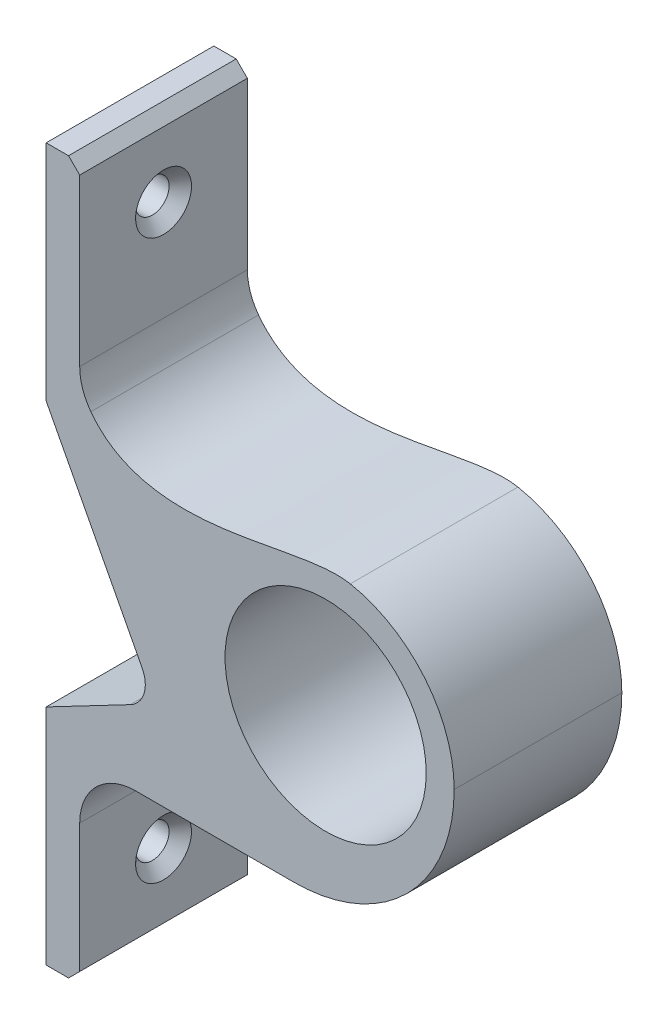
ISO-10303-21;
HEADER;
FILE_DESCRIPTION(('STEP AP214'),'2;1');
FILE_NAME('part.step','',(''),(''),'','','');
FILE_SCHEMA(('AUTOMOTIVE_DESIGN { 1 0 10303 214 1 1 1 1 }'));
ENDSEC;
DATA;
#1=APPLICATION_CONTEXT('core data for automotive mechanical design processes');
#2=APPLICATION_PROTOCOL_DEFINITION('international standard','automotive_design',2000,#1);
#3=PRODUCT_CONTEXT('',#1,'mechanical');
#4=PRODUCT('Part','Part','',(#3));
#5=PRODUCT_RELATED_PRODUCT_CATEGORY('part','',(#4));
#6=PRODUCT_DEFINITION_FORMATION('','',#4);
#7=PRODUCT_DEFINITION_CONTEXT('part definition',#1,'design');
#8=PRODUCT_DEFINITION('design','',#6,#7);
#9=PRODUCT_DEFINITION_SHAPE('','',#8);
#10=(LENGTH_UNIT() NAMED_UNIT(*) SI_UNIT(.MILLI.,.METRE.));
#11=(NAMED_UNIT(*) PLANE_ANGLE_UNIT() SI_UNIT($,.RADIAN.));
#12=(NAMED_UNIT(*) SI_UNIT($,.STERADIAN.) SOLID_ANGLE_UNIT());
#13=UNCERTAINTY_MEASURE_WITH_UNIT(LENGTH_MEASURE(1.E-05),#10,'distance_accuracy_value','');
#14=(GEOMETRIC_REPRESENTATION_CONTEXT(3) GLOBAL_UNCERTAINTY_ASSIGNED_CONTEXT((#13)) GLOBAL_UNIT_ASSIGNED_CONTEXT((#10,
#11,#12)) REPRESENTATION_CONTEXT('',''));
#15=CARTESIAN_POINT('',(0.,0.,0.));
#16=DIRECTION('',(0.,0.,1.));
#17=DIRECTION('',(1.,0.,0.));
#18=AXIS2_PLACEMENT_3D('',#15,#16,#17);
#19=CARTESIAN_POINT('',(44.2934608177406,0.,15.));
#20=DIRECTION('',(0.,0.,-1.));
#21=DIRECTION('',(-1.,0.,0.));
#22=AXIS2_PLACEMENT_3D('',#19,#20,#21);
#23=CYLINDRICAL_SURFACE('',#22,28.7065391822594);
#24=CARTESIAN_POINT('',(44.2934608177406,0.,-15.));
#25=DIRECTION('',(0.,0.,1.));
#26=DIRECTION('',(1.,0.,0.));
#27=AXIS2_PLACEMENT_3D('',#24,#25,#26);
#28=CIRCLE('',#27,28.7065391822594);
#29=CARTESIAN_POINT('',(44.2934608177406,-28.7065391822594,-15.));
#30=VERTEX_POINT('',#29);
#31=CARTESIAN_POINT('',(73.,0.,-15.));
#32=VERTEX_POINT('',#31);
#33=EDGE_CURVE('E197',#30,#32,#28,.T.);
#34=ORIENTED_EDGE('',*,*,#33,.T.);
#35=DIRECTION('',(0.,0.,-1.));
#36=VECTOR('',#35,1.);
#37=CARTESIAN_POINT('',(73.,0.,15.));
#38=LINE('',#37,#36);
#39=CARTESIAN_POINT('',(73.,0.,15.));
#40=VERTEX_POINT('',#39);
#41=EDGE_CURVE('E176',#40,#32,#38,.T.);
#42=ORIENTED_EDGE('',*,*,#41,.F.);
#43=CARTESIAN_POINT('',(44.2934608177406,0.,15.));
#44=DIRECTION('',(0.,0.,1.));
#45=DIRECTION('',(1.,0.,0.));
#46=AXIS2_PLACEMENT_3D('',#43,#44,#45);
#47=CIRCLE('',#46,28.7065391822594);
#48=CARTESIAN_POINT('',(44.2934608177406,-28.7065391822594,15.));
#49=VERTEX_POINT('',#48);
#50=EDGE_CURVE('E183',#49,#40,#47,.T.);
#51=ORIENTED_EDGE('',*,*,#50,.F.);
#52=DIRECTION('',(0.,0.,-1.));
#53=VECTOR('',#52,1.);
#54=CARTESIAN_POINT('',(44.2934608177406,-28.7065391822594,15.));
#55=LINE('',#54,#53);
#56=EDGE_CURVE('E316',#49,#30,#55,.T.);
#57=ORIENTED_EDGE('',*,*,#56,.T.);
#58=EDGE_LOOP('',(#34,#42,#51,#57));
#59=FACE_BOUND('',#58,.T.);
#60=ADVANCED_FACE('F49',(#59),#23,.T.);
#61=CARTESIAN_POINT('',(50.,0.,15.));
#62=DIRECTION('',(0.,0.,-1.));
#63=DIRECTION('',(-1.,0.,0.));
#64=AXIS2_PLACEMENT_3D('',#61,#62,#63);
#65=CYLINDRICAL_SURFACE('',#64,23.);
#66=CARTESIAN_POINT('',(50.,0.,-15.));
#67=DIRECTION('',(0.,0.,1.));
#68=DIRECTION('',(1.,0.,0.));
#69=AXIS2_PLACEMENT_3D('',#66,#67,#68);
#70=CIRCLE('',#69,23.);
#71=CARTESIAN_POINT('',(54.4128546699778,22.5726984133855,-15.));
#72=VERTEX_POINT('',#71);
#73=EDGE_CURVE('E324',#32,#72,#70,.T.);
#74=ORIENTED_EDGE('',*,*,#73,.T.);
#75=DIRECTION('',(0.,0.,-1.));
#76=VECTOR('',#75,1.);
#77=CARTESIAN_POINT('',(54.4128546699778,22.5726984133855,15.));
#78=LINE('',#77,#76);
#79=CARTESIAN_POINT('',(54.4128546699778,22.5726984133855,15.));
#80=VERTEX_POINT('',#79);
#81=EDGE_CURVE('E179',#80,#72,#78,.T.);
#82=ORIENTED_EDGE('',*,*,#81,.F.);
#83=CARTESIAN_POINT('',(50.,0.,15.));
#84=DIRECTION('',(0.,0.,1.));
#85=DIRECTION('',(1.,0.,0.));
#86=AXIS2_PLACEMENT_3D('',#83,#84,#85);
#87=CIRCLE('',#86,23.);
#88=EDGE_CURVE('E172',#40,#80,#87,.T.);
#89=ORIENTED_EDGE('',*,*,#88,.F.);
#90=ORIENTED_EDGE('',*,*,#41,.T.);
#91=EDGE_LOOP('',(#74,#82,#89,#90));
#92=FACE_BOUND('',#91,.T.);
#93=ADVANCED_FACE('F174',(#92),#65,.T.);
#94=CARTESIAN_POINT('',(54.4128546699778,22.5726984133854,15.));
#95=CARTESIAN_POINT('',(48.6988017547461,23.689768452142,15.));
#96=CARTESIAN_POINT('',(29.1828460665617,17.0842887931431,15.));
#97=CARTESIAN_POINT('',(12.2663688848882,20.342938845259,15.));
#98=CARTESIAN_POINT('',(7.99709294707413,26.041058175316,15.));
#99=B_SPLINE_CURVE_WITH_KNOTS('',3,(#94,#95,#96,#97,#98),.UNSPECIFIED.,.F.,.F.,(4,1,4),(0.,
0.577740896312587,1.),.UNSPECIFIED.);
#100=DIRECTION('',(0.,0.,-1.));
#101=VECTOR('',#100,1.);
#102=SURFACE_OF_LINEAR_EXTRUSION('',#99,#101);
#103=CARTESIAN_POINT('',(54.4128546699778,22.5726984133854,-15.));
#104=CARTESIAN_POINT('',(48.6988017547461,23.689768452142,-15.));
#105=CARTESIAN_POINT('',(29.1828460665617,17.0842887931431,-15.));
#106=CARTESIAN_POINT('',(12.2663688848882,20.342938845259,-15.));
#107=CARTESIAN_POINT('',(7.99709294707413,26.041058175316,-15.));
#108=B_SPLINE_CURVE_WITH_KNOTS('',3,(#103,#104,#105,#106,#107),.UNSPECIFIED.,.F.,.F.,(4,1,4),
(0.,0.577740896312587,1.),.UNSPECIFIED.);
#109=CARTESIAN_POINT('',(7.99709294707416,26.041058175316,-15.));
#110=VERTEX_POINT('',#109);
#111=EDGE_CURVE('E327',#72,#110,#108,.T.);
#112=ORIENTED_EDGE('',*,*,#111,.T.);
#113=DIRECTION('',(0.,0.,-1.));
#114=VECTOR('',#113,1.);
#115=CARTESIAN_POINT('',(7.99709294707416,26.041058175316,15.));
#116=LINE('',#115,#114);
#117=CARTESIAN_POINT('',(7.99709294707416,26.041058175316,15.));
#118=VERTEX_POINT('',#117);
#119=EDGE_CURVE('E206',#118,#110,#116,.T.);
#120=ORIENTED_EDGE('',*,*,#119,.F.);
#121=EDGE_CURVE('E182',#80,#118,#99,.T.);
#122=ORIENTED_EDGE('',*,*,#121,.F.);
#123=ORIENTED_EDGE('',*,*,#81,.T.);
#124=EDGE_LOOP('',(#112,#120,#122,#123));
#125=FACE_BOUND('',#124,.T.);
#126=ADVANCED_FACE('F262',(#125),#102,.F.);
#127=CARTESIAN_POINT('',(16.,32.0371801472433,15.));
#128=DIRECTION('',(0.,0.,-1.));
#129=DIRECTION('',(-1.,0.,0.));
#130=AXIS2_PLACEMENT_3D('',#127,#128,#129);
#131=CYLINDRICAL_SURFACE('',#130,10.);
#132=CARTESIAN_POINT('',(16.,32.0371801472433,-15.));
#133=DIRECTION('',(0.,0.,1.));
#134=DIRECTION('',(1.,0.,0.));
#135=AXIS2_PLACEMENT_3D('',#132,#133,#134);
#136=CIRCLE('',#135,10.);
#137=CARTESIAN_POINT('',(6.,32.0371801472434,-15.));
#138=VERTEX_POINT('',#137);
#139=EDGE_CURVE('E333',#138,#110,#136,.T.);
#140=ORIENTED_EDGE('',*,*,#139,.F.);
#141=DIRECTION('',(0.,0.,-1.));
#142=VECTOR('',#141,1.);
#143=CARTESIAN_POINT('',(6.,32.0371801472434,15.));
#144=LINE('',#143,#142);
#145=CARTESIAN_POINT('',(6.,32.0371801472434,15.));
#146=VERTEX_POINT('',#145);
#147=EDGE_CURVE('E406',#146,#138,#144,.T.);
#148=ORIENTED_EDGE('',*,*,#147,.F.);
#149=CARTESIAN_POINT('',(16.,32.0371801472433,15.));
#150=DIRECTION('',(0.,0.,1.));
#151=DIRECTION('',(1.,0.,0.));
#152=AXIS2_PLACEMENT_3D('',#149,#150,#151);
#153=CIRCLE('',#152,10.);
#154=EDGE_CURVE('E417',#146,#118,#153,.T.);
#155=ORIENTED_EDGE('',*,*,#154,.T.);
#156=ORIENTED_EDGE('',*,*,#119,.T.);
#157=EDGE_LOOP('',(#140,#148,#155,#156));
#158=FACE_BOUND('',#157,.T.);
#159=ADVANCED_FACE('F414',(#158),#131,.F.);
#160=CARTESIAN_POINT('',(6.00000000000001,0.,15.));
#161=DIRECTION('',(1.,0.,0.));
#162=DIRECTION('',(0.,1.,0.));
#163=AXIS2_PLACEMENT_3D('',#160,#161,#162);
#164=PLANE('',#163);
#165=CARTESIAN_POINT('',(6.,50.,0.));
#166=DIRECTION('',(1.,0.,0.));
#167=DIRECTION('',(0.,1.,0.));
#168=AXIS2_PLACEMENT_3D('',#165,#166,#167);
#169=CIRCLE('',#168,5.00000000000001);
#170=CARTESIAN_POINT('',(6.,55.,0.));
#171=VERTEX_POINT('',#170);
#172=EDGE_CURVE('E231',#171,#171,#169,.F.);
#173=ORIENTED_EDGE('',*,*,#172,.T.);
#174=EDGE_LOOP('',(#173));
#175=FACE_BOUND('',#174,.T.);
#176=DIRECTION('',(0.,-1.,0.));
#177=VECTOR('',#176,1.);
#178=CARTESIAN_POINT('',(6.00000000000001,0.,-15.));
#179=LINE('',#178,#177);
#180=CARTESIAN_POINT('',(6.,61.7065391822594,-15.));
#181=VERTEX_POINT('',#180);
#182=EDGE_CURVE('E340',#181,#138,#179,.T.);
#183=ORIENTED_EDGE('',*,*,#182,.F.);
#184=DIRECTION('',(0.,0.,1.));
#185=VECTOR('',#184,1.);
#186=CARTESIAN_POINT('',(6.,61.7065391822594,15.));
#187=LINE('',#186,#185);
#188=CARTESIAN_POINT('',(6.,61.7065391822594,15.));
#189=VERTEX_POINT('',#188);
#190=EDGE_CURVE('E74',#181,#189,#187,.T.);
#191=ORIENTED_EDGE('',*,*,#190,.T.);
#192=DIRECTION('',(0.,-1.,0.));
#193=VECTOR('',#192,1.);
#194=CARTESIAN_POINT('',(6.00000000000001,0.,15.));
#195=LINE('',#194,#193);
#196=EDGE_CURVE('E423',#189,#146,#195,.T.);
#197=ORIENTED_EDGE('',*,*,#196,.T.);
#198=ORIENTED_EDGE('',*,*,#147,.T.);
#199=EDGE_LOOP('',(#183,#191,#197,#198));
#200=FACE_BOUND('',#199,.T.);
#201=ADVANCED_FACE('F422',(#175,#200),#164,.T.);
#202=CARTESIAN_POINT('',(0.,63.7065391822594,15.));
#203=DIRECTION('',(0.,1.,0.));
#204=DIRECTION('',(0.,0.,1.));
#205=AXIS2_PLACEMENT_3D('',#202,#203,#204);
#206=PLANE('',#205);
#207=DIRECTION('',(1.,0.,0.));
#208=VECTOR('',#207,1.);
#209=CARTESIAN_POINT('',(0.,63.7065391822594,15.));
#210=LINE('',#209,#208);
#211=CARTESIAN_POINT('',(0.,63.7065391822594,15.));
#212=VERTEX_POINT('',#211);
#213=CARTESIAN_POINT('',(4.,63.7065391822594,15.));
#214=VERTEX_POINT('',#213);
#215=EDGE_CURVE('E428',#212,#214,#210,.T.);
#216=ORIENTED_EDGE('',*,*,#215,.T.);
#217=DIRECTION('',(0.,0.,-1.));
#218=VECTOR('',#217,1.);
#219=CARTESIAN_POINT('',(4.,63.7065391822594,15.));
#220=LINE('',#219,#218);
#221=CARTESIAN_POINT('',(4.,63.7065391822594,-15.));
#222=VERTEX_POINT('',#221);
#223=EDGE_CURVE('E227',#214,#222,#220,.T.);
#224=ORIENTED_EDGE('',*,*,#223,.T.);
#225=DIRECTION('',(1.,0.,0.));
#226=VECTOR('',#225,1.);
#227=CARTESIAN_POINT('',(0.,63.7065391822594,-15.));
#228=LINE('',#227,#226);
#229=CARTESIAN_POINT('',(0.,63.7065391822594,-15.));
#230=VERTEX_POINT('',#229);
#231=EDGE_CURVE('E343',#230,#222,#228,.T.);
#232=ORIENTED_EDGE('',*,*,#231,.F.);
#233=DIRECTION('',(0.,0.,-1.));
#234=VECTOR('',#233,1.);
#235=CARTESIAN_POINT('',(0.,63.7065391822594,15.));
#236=LINE('',#235,#234);
#237=EDGE_CURVE('E403',#212,#230,#236,.T.);
#238=ORIENTED_EDGE('',*,*,#237,.F.);
#239=EDGE_LOOP('',(#216,#224,#232,#238));
#240=FACE_BOUND('',#239,.T.);
#241=ADVANCED_FACE('F502',(#240),#206,.T.);
#242=CARTESIAN_POINT('',(0.,0.,15.));
#243=DIRECTION('',(-1.,0.,0.));
#244=DIRECTION('',(0.,-1.,0.));
#245=AXIS2_PLACEMENT_3D('',#242,#243,#244);
#246=PLANE('',#245);
#247=CARTESIAN_POINT('',(0.,50.,0.));
#248=DIRECTION('',(1.,0.,0.));
#249=DIRECTION('',(0.,0.,-1.));
#250=AXIS2_PLACEMENT_3D('',#247,#248,#249);
#251=CIRCLE('',#250,3.);
#252=CARTESIAN_POINT('',(0.,50.,-3.));
#253=VERTEX_POINT('',#252);
#254=EDGE_CURVE('E676',#253,#253,#251,.T.);
#255=ORIENTED_EDGE('',*,*,#254,.T.);
#256=EDGE_LOOP('',(#255));
#257=FACE_BOUND('',#256,.T.);
#258=DIRECTION('',(0.,1.,0.));
#259=VECTOR('',#258,1.);
#260=CARTESIAN_POINT('',(0.,0.,-15.));
#261=LINE('',#260,#259);
#262=CARTESIAN_POINT('',(0.,23.7065391822594,-15.));
#263=VERTEX_POINT('',#262);
#264=EDGE_CURVE('E347',#263,#230,#261,.T.);
#265=ORIENTED_EDGE('',*,*,#264,.F.);
#266=DIRECTION('',(0.,0.,-1.));
#267=VECTOR('',#266,1.);
#268=CARTESIAN_POINT('',(0.,23.7065391822594,15.));
#269=LINE('',#268,#267);
#270=CARTESIAN_POINT('',(0.,23.7065391822594,15.));
#271=VERTEX_POINT('',#270);
#272=EDGE_CURVE('E400',#271,#263,#269,.T.);
#273=ORIENTED_EDGE('',*,*,#272,.F.);
#274=DIRECTION('',(0.,1.,0.));
#275=VECTOR('',#274,1.);
#276=CARTESIAN_POINT('',(0.,0.,15.));
#277=LINE('',#276,#275);
#278=EDGE_CURVE('E437',#271,#212,#277,.T.);
#279=ORIENTED_EDGE('',*,*,#278,.T.);
#280=ORIENTED_EDGE('',*,*,#237,.T.);
#281=EDGE_LOOP('',(#265,#273,#279,#280));
#282=FACE_BOUND('',#281,.T.);
#283=ADVANCED_FACE('F499',(#257,#282),#246,.T.);
#284=CARTESIAN_POINT('',(9.74414688808171,5.10407694137614,15.));
#285=DIRECTION('',(0.885831535280155,0.464006994670558,0.));
#286=DIRECTION('',(-0.464006994670558,0.885831535280155,0.));
#287=AXIS2_PLACEMENT_3D('',#284,#285,#286);
#288=PLANE('',#287);
#289=DIRECTION('',(0.464006994670558,-0.885831535280155,0.));
#290=VECTOR('',#289,1.);
#291=CARTESIAN_POINT('',(9.74414688808171,5.10407694137614,-15.));
#292=LINE('',#291,#290);
#293=CARTESIAN_POINT('',(17.1682588028106,-9.06922762310634,-15.));
#294=VERTEX_POINT('',#293);
#295=EDGE_CURVE('E351',#263,#294,#292,.T.);
#296=ORIENTED_EDGE('',*,*,#295,.T.);
#297=DIRECTION('',(0.,0.,-1.));
#298=VECTOR('',#297,1.);
#299=CARTESIAN_POINT('',(17.1682588028106,-9.06922762310634,15.));
#300=LINE('',#299,#298);
#301=CARTESIAN_POINT('',(17.1682588028106,-9.06922762310634,15.));
#302=VERTEX_POINT('',#301);
#303=EDGE_CURVE('E397',#302,#294,#300,.T.);
#304=ORIENTED_EDGE('',*,*,#303,.F.);
#305=DIRECTION('',(0.464006994670558,-0.885831535280155,0.));
#306=VECTOR('',#305,1.);
#307=CARTESIAN_POINT('',(9.74414688808171,5.10407694137614,15.));
#308=LINE('',#307,#306);
#309=EDGE_CURVE('E441',#271,#302,#308,.T.);
#310=ORIENTED_EDGE('',*,*,#309,.F.);
#311=ORIENTED_EDGE('',*,*,#272,.T.);
#312=EDGE_LOOP('',(#296,#304,#310,#311));
#313=FACE_BOUND('',#312,.T.);
#314=ADVANCED_FACE('F495',(#313),#288,.F.);
#315=CARTESIAN_POINT('',(12.7391011264098,-11.3892625964591,15.));
#316=DIRECTION('',(0.,0.,-1.));
#317=DIRECTION('',(-1.,0.,0.));
#318=AXIS2_PLACEMENT_3D('',#315,#316,#317);
#319=CYLINDRICAL_SURFACE('',#318,5.00000000000001);
#320=CARTESIAN_POINT('',(12.7391011264098,-11.3892625964591,-15.));
#321=DIRECTION('',(0.,0.,1.));
#322=DIRECTION('',(1.,0.,0.));
#323=AXIS2_PLACEMENT_3D('',#320,#321,#322);
#324=CIRCLE('',#323,5.00000000000001);
#325=CARTESIAN_POINT('',(15.0591360997626,-15.8184202728599,-15.));
#326=VERTEX_POINT('',#325);
#327=EDGE_CURVE('E355',#326,#294,#324,.T.);
#328=ORIENTED_EDGE('',*,*,#327,.F.);
#329=DIRECTION('',(0.,0.,-1.));
#330=VECTOR('',#329,1.);
#331=CARTESIAN_POINT('',(15.0591360997626,-15.8184202728599,15.));
#332=LINE('',#331,#330);
#333=CARTESIAN_POINT('',(15.0591360997626,-15.8184202728599,15.));
#334=VERTEX_POINT('',#333);
#335=EDGE_CURVE('E394',#334,#326,#332,.T.);
#336=ORIENTED_EDGE('',*,*,#335,.F.);
#337=CARTESIAN_POINT('',(12.7391011264098,-11.3892625964591,15.));
#338=DIRECTION('',(0.,0.,1.));
#339=DIRECTION('',(1.,0.,0.));
#340=AXIS2_PLACEMENT_3D('',#337,#338,#339);
#341=CIRCLE('',#340,5.00000000000001);
#342=EDGE_CURVE('E444',#334,#302,#341,.T.);
#343=ORIENTED_EDGE('',*,*,#342,.T.);
#344=ORIENTED_EDGE('',*,*,#303,.T.);
#345=EDGE_LOOP('',(#328,#336,#343,#344));
#346=FACE_BOUND('',#345,.T.);
#347=ADVANCED_FACE('F491',(#346),#319,.F.);
#348=CARTESIAN_POINT('',(9.74414688808171,-18.6024622408833,15.));
#349=DIRECTION('',(-0.464006994670558,0.885831535280155,0.));
#350=DIRECTION('',(-0.885831535280155,-0.464006994670558,0.));
#351=AXIS2_PLACEMENT_3D('',#348,#349,#350);
#352=PLANE('',#351);
#353=DIRECTION('',(0.885831535280155,0.464006994670558,0.));
#354=VECTOR('',#353,1.);
#355=CARTESIAN_POINT('',(9.74414688808171,-18.6024622408833,-15.));
#356=LINE('',#355,#354);
#357=CARTESIAN_POINT('',(0.,-23.7065391822594,-15.));
#358=VERTEX_POINT('',#357);
#359=EDGE_CURVE('E359',#358,#326,#356,.T.);
#360=ORIENTED_EDGE('',*,*,#359,.F.);
#361=DIRECTION('',(0.,0.,-1.));
#362=VECTOR('',#361,1.);
#363=CARTESIAN_POINT('',(0.,-23.7065391822594,15.));
#364=LINE('',#363,#362);
#365=CARTESIAN_POINT('',(0.,-23.7065391822594,15.));
#366=VERTEX_POINT('',#365);
#367=EDGE_CURVE('E391',#366,#358,#364,.T.);
#368=ORIENTED_EDGE('',*,*,#367,.F.);
#369=DIRECTION('',(0.885831535280155,0.464006994670558,0.));
#370=VECTOR('',#369,1.);
#371=CARTESIAN_POINT('',(9.74414688808171,-18.6024622408833,15.));
#372=LINE('',#371,#370);
#373=EDGE_CURVE('E448',#366,#334,#372,.T.);
#374=ORIENTED_EDGE('',*,*,#373,.T.);
#375=ORIENTED_EDGE('',*,*,#335,.T.);
#376=EDGE_LOOP('',(#360,#368,#374,#375));
#377=FACE_BOUND('',#376,.T.);
#378=ADVANCED_FACE('F487',(#377),#352,.T.);
#379=CARTESIAN_POINT('',(0.,0.,15.));
#380=DIRECTION('',(1.,0.,0.));
#381=DIRECTION('',(0.,1.,0.));
#382=AXIS2_PLACEMENT_3D('',#379,#380,#381);
#383=PLANE('',#382);
#384=CARTESIAN_POINT('',(0.,-50.,0.));
#385=DIRECTION('',(1.,0.,0.));
#386=DIRECTION('',(0.,0.,-1.));
#387=AXIS2_PLACEMENT_3D('',#384,#385,#386);
#388=CIRCLE('',#387,3.);
#389=CARTESIAN_POINT('',(0.,-50.,-3.));
#390=VERTEX_POINT('',#389);
#391=EDGE_CURVE('E321',#390,#390,#388,.T.);
#392=ORIENTED_EDGE('',*,*,#391,.T.);
#393=EDGE_LOOP('',(#392));
#394=FACE_BOUND('',#393,.T.);
#395=DIRECTION('',(0.,-1.,0.));
#396=VECTOR('',#395,1.);
#397=CARTESIAN_POINT('',(0.,0.,-15.));
#398=LINE('',#397,#396);
#399=CARTESIAN_POINT('',(0.,-63.7065391822594,-15.));
#400=VERTEX_POINT('',#399);
#401=EDGE_CURVE('E363',#358,#400,#398,.T.);
#402=ORIENTED_EDGE('',*,*,#401,.T.);
#403=DIRECTION('',(0.,0.,-1.));
#404=VECTOR('',#403,1.);
#405=CARTESIAN_POINT('',(0.,-63.7065391822594,15.));
#406=LINE('',#405,#404);
#407=CARTESIAN_POINT('',(0.,-63.7065391822594,15.));
#408=VERTEX_POINT('',#407);
#409=EDGE_CURVE('E387',#408,#400,#406,.T.);
#410=ORIENTED_EDGE('',*,*,#409,.F.);
#411=DIRECTION('',(0.,-1.,0.));
#412=VECTOR('',#411,1.);
#413=CARTESIAN_POINT('',(0.,0.,15.));
#414=LINE('',#413,#412);
#415=EDGE_CURVE('E310',#366,#408,#414,.T.);
#416=ORIENTED_EDGE('',*,*,#415,.F.);
#417=ORIENTED_EDGE('',*,*,#367,.T.);
#418=EDGE_LOOP('',(#402,#410,#416,#417));
#419=FACE_BOUND('',#418,.T.);
#420=ADVANCED_FACE('F457',(#394,#419),#383,.F.);
#421=CARTESIAN_POINT('',(0.,-63.7065391822594,15.));
#422=DIRECTION('',(0.,1.,0.));
#423=DIRECTION('',(0.,0.,1.));
#424=AXIS2_PLACEMENT_3D('',#421,#422,#423);
#425=PLANE('',#424);
#426=DIRECTION('',(1.,0.,0.));
#427=VECTOR('',#426,1.);
#428=CARTESIAN_POINT('',(0.,-63.7065391822594,-15.));
#429=LINE('',#428,#427);
#430=CARTESIAN_POINT('',(4.00000000000001,-63.7065391822594,-15.));
#431=VERTEX_POINT('',#430);
#432=EDGE_CURVE('E366',#400,#431,#429,.T.);
#433=ORIENTED_EDGE('',*,*,#432,.T.);
#434=DIRECTION('',(0.,0.,1.));
#435=VECTOR('',#434,1.);
#436=CARTESIAN_POINT('',(4.00000000000001,-63.7065391822594,15.));
#437=LINE('',#436,#435);
#438=CARTESIAN_POINT('',(4.00000000000001,-63.7065391822594,15.));
#439=VERTEX_POINT('',#438);
#440=EDGE_CURVE('E219',#431,#439,#437,.T.);
#441=ORIENTED_EDGE('',*,*,#440,.T.);
#442=DIRECTION('',(1.,0.,0.));
#443=VECTOR('',#442,1.);
#444=CARTESIAN_POINT('',(0.,-63.7065391822594,15.));
#445=LINE('',#444,#443);
#446=EDGE_CURVE('E297',#408,#439,#445,.T.);
#447=ORIENTED_EDGE('',*,*,#446,.F.);
#448=ORIENTED_EDGE('',*,*,#409,.T.);
#449=EDGE_LOOP('',(#433,#441,#447,#448));
#450=FACE_BOUND('',#449,.T.);
#451=ADVANCED_FACE('F461',(#450),#425,.F.);
#452=CARTESIAN_POINT('',(6.00000000000001,0.,15.));
#453=DIRECTION('',(-1.,0.,0.));
#454=DIRECTION('',(0.,-1.,0.));
#455=AXIS2_PLACEMENT_3D('',#452,#453,#454);
#456=PLANE('',#455);
#457=CARTESIAN_POINT('',(6.00000000000001,-50.,0.));
#458=DIRECTION('',(-1.,0.,0.));
#459=DIRECTION('',(0.,-1.,0.));
#460=AXIS2_PLACEMENT_3D('',#457,#458,#459);
#461=CIRCLE('',#460,5.00000000000001);
#462=CARTESIAN_POINT('',(6.00000000000001,-55.,0.));
#463=VERTEX_POINT('',#462);
#464=EDGE_CURVE('E199',#463,#463,#461,.T.);
#465=ORIENTED_EDGE('',*,*,#464,.T.);
#466=EDGE_LOOP('',(#465));
#467=FACE_BOUND('',#466,.T.);
#468=DIRECTION('',(0.,1.,0.));
#469=VECTOR('',#468,1.);
#470=CARTESIAN_POINT('',(6.00000000000001,0.,15.));
#471=LINE('',#470,#469);
#472=CARTESIAN_POINT('',(6.00000000000001,-61.7065391822594,15.));
#473=VERTEX_POINT('',#472);
#474=CARTESIAN_POINT('',(6.00000000000001,-38.7065391822595,15.));
#475=VERTEX_POINT('',#474);
#476=EDGE_CURVE('E294',#473,#475,#471,.T.);
#477=ORIENTED_EDGE('',*,*,#476,.F.);
#478=DIRECTION('',(0.,0.,-1.));
#479=VECTOR('',#478,1.);
#480=CARTESIAN_POINT('',(6.00000000000001,-61.7065391822594,15.));
#481=LINE('',#480,#479);
#482=CARTESIAN_POINT('',(6.00000000000001,-61.7065391822594,-15.));
#483=VERTEX_POINT('',#482);
#484=EDGE_CURVE('E204',#473,#483,#481,.T.);
#485=ORIENTED_EDGE('',*,*,#484,.T.);
#486=DIRECTION('',(0.,1.,0.));
#487=VECTOR('',#486,1.);
#488=CARTESIAN_POINT('',(6.00000000000001,0.,-15.));
#489=LINE('',#488,#487);
#490=CARTESIAN_POINT('',(6.00000000000001,-38.7065391822595,-15.));
#491=VERTEX_POINT('',#490);
#492=EDGE_CURVE('E370',#483,#491,#489,.T.);
#493=ORIENTED_EDGE('',*,*,#492,.T.);
#494=DIRECTION('',(0.,0.,-1.));
#495=VECTOR('',#494,1.);
#496=CARTESIAN_POINT('',(6.00000000000001,-38.7065391822595,15.));
#497=LINE('',#496,#495);
#498=EDGE_CURVE('E302',#475,#491,#497,.T.);
#499=ORIENTED_EDGE('',*,*,#498,.F.);
#500=EDGE_LOOP('',(#477,#485,#493,#499));
#501=FACE_BOUND('',#500,.T.);
#502=ADVANCED_FACE('F299',(#467,#501),#456,.F.);
#503=CARTESIAN_POINT('',(16.,-38.7065391822594,15.));
#504=DIRECTION('',(0.,0.,-1.));
#505=DIRECTION('',(-1.,0.,0.));
#506=AXIS2_PLACEMENT_3D('',#503,#504,#505);
#507=CYLINDRICAL_SURFACE('',#506,10.);
#508=CARTESIAN_POINT('',(16.,-38.7065391822594,-15.));
#509=DIRECTION('',(0.,0.,1.));
#510=DIRECTION('',(1.,0.,0.));
#511=AXIS2_PLACEMENT_3D('',#508,#509,#510);
#512=CIRCLE('',#511,10.);
#513=CARTESIAN_POINT('',(16.0000000000001,-28.7065391822594,-15.));
#514=VERTEX_POINT('',#513);
#515=EDGE_CURVE('E373',#491,#514,#512,.F.);
#516=ORIENTED_EDGE('',*,*,#515,.T.);
#517=DIRECTION('',(0.,0.,-1.));
#518=VECTOR('',#517,1.);
#519=CARTESIAN_POINT('',(16.0000000000001,-28.7065391822594,15.));
#520=LINE('',#519,#518);
#521=CARTESIAN_POINT('',(16.0000000000001,-28.7065391822594,15.));
#522=VERTEX_POINT('',#521);
#523=EDGE_CURVE('E381',#522,#514,#520,.T.);
#524=ORIENTED_EDGE('',*,*,#523,.F.);
#525=CARTESIAN_POINT('',(16.,-38.7065391822594,15.));
#526=DIRECTION('',(0.,0.,1.));
#527=DIRECTION('',(1.,0.,0.));
#528=AXIS2_PLACEMENT_3D('',#525,#526,#527);
#529=CIRCLE('',#528,10.);
#530=EDGE_CURVE('E305',#475,#522,#529,.F.);
#531=ORIENTED_EDGE('',*,*,#530,.F.);
#532=ORIENTED_EDGE('',*,*,#498,.T.);
#533=EDGE_LOOP('',(#516,#524,#531,#532));
#534=FACE_BOUND('',#533,.T.);
#535=ADVANCED_FACE('F270',(#534),#507,.F.);
#536=CARTESIAN_POINT('',(50.,0.,15.));
#537=DIRECTION('',(0.,0.,-1.));
#538=DIRECTION('',(-1.,0.,0.));
#539=AXIS2_PLACEMENT_3D('',#536,#537,#538);
#540=CYLINDRICAL_SURFACE('',#539,18.);
#541=CARTESIAN_POINT('',(50.,0.,15.));
#542=DIRECTION('',(0.,0.,1.));
#543=DIRECTION('',(1.,0.,0.));
#544=AXIS2_PLACEMENT_3D('',#541,#542,#543);
#545=CIRCLE('',#544,18.);
#546=CARTESIAN_POINT('',(68.,0.,15.));
#547=VERTEX_POINT('',#546);
#548=EDGE_CURVE('E194',#547,#547,#545,.F.);
#549=ORIENTED_EDGE('',*,*,#548,.F.);
#550=EDGE_LOOP('',(#549));
#551=FACE_BOUND('',#550,.T.);
#552=CARTESIAN_POINT('',(50.,0.,-15.));
#553=DIRECTION('',(0.,0.,1.));
#554=DIRECTION('',(1.,0.,0.));
#555=AXIS2_PLACEMENT_3D('',#552,#553,#554);
#556=CIRCLE('',#555,18.);
#557=CARTESIAN_POINT('',(68.,0.,-15.));
#558=VERTEX_POINT('',#557);
#559=EDGE_CURVE('E317',#558,#558,#556,.F.);
#560=ORIENTED_EDGE('',*,*,#559,.T.);
#561=EDGE_LOOP('',(#560));
#562=FACE_BOUND('',#561,.T.);
#563=ADVANCED_FACE('F266',(#551,#562),#540,.F.);
#564=CARTESIAN_POINT('',(0.,-28.7065391822594,15.));
#565=DIRECTION('',(0.,1.,0.));
#566=DIRECTION('',(0.,0.,1.));
#567=AXIS2_PLACEMENT_3D('',#564,#565,#566);
#568=PLANE('',#567);
#569=DIRECTION('',(1.,0.,0.));
#570=VECTOR('',#569,1.);
#571=CARTESIAN_POINT('',(0.,-28.7065391822594,-15.));
#572=LINE('',#571,#570);
#573=EDGE_CURVE('E376',#514,#30,#572,.T.);
#574=ORIENTED_EDGE('',*,*,#573,.T.);
#575=ORIENTED_EDGE('',*,*,#56,.F.);
#576=DIRECTION('',(1.,0.,0.));
#577=VECTOR('',#576,1.);
#578=CARTESIAN_POINT('',(0.,-28.7065391822594,15.));
#579=LINE('',#578,#577);
#580=EDGE_CURVE('E189',#522,#49,#579,.T.);
#581=ORIENTED_EDGE('',*,*,#580,.F.);
#582=ORIENTED_EDGE('',*,*,#523,.T.);
#583=EDGE_LOOP('',(#574,#575,#581,#582));
#584=FACE_BOUND('',#583,.T.);
#585=ADVANCED_FACE('F269',(#584),#568,.F.);
#586=CARTESIAN_POINT('',(0.,0.,15.));
#587=DIRECTION('',(0.,0.,1.));
#588=DIRECTION('',(1.,0.,0.));
#589=AXIS2_PLACEMENT_3D('',#586,#587,#588);
#590=PLANE('',#589);
#591=ORIENTED_EDGE('',*,*,#548,.T.);
#592=EDGE_LOOP('',(#591));
#593=FACE_BOUND('',#592,.T.);
#594=ORIENTED_EDGE('',*,*,#446,.T.);
#595=DIRECTION('',(-0.707106781186552,-0.707106781186543,0.));
#596=VECTOR('',#595,1.);
#597=CARTESIAN_POINT('',(33.8532695911297,-33.8532695911301,15.));
#598=LINE('',#597,#596);
#599=EDGE_CURVE('E224',#439,#473,#598,.F.);
#600=ORIENTED_EDGE('',*,*,#599,.T.);
#601=ORIENTED_EDGE('',*,*,#476,.T.);
#602=ORIENTED_EDGE('',*,*,#530,.T.);
#603=ORIENTED_EDGE('',*,*,#580,.T.);
#604=ORIENTED_EDGE('',*,*,#50,.T.);
#605=ORIENTED_EDGE('',*,*,#88,.T.);
#606=ORIENTED_EDGE('',*,*,#121,.T.);
#607=ORIENTED_EDGE('',*,*,#154,.F.);
#608=ORIENTED_EDGE('',*,*,#196,.F.);
#609=DIRECTION('',(0.70710678118655,-0.707106781186545,0.));
#610=VECTOR('',#609,1.);
#611=CARTESIAN_POINT('',(33.8532695911297,33.8532695911299,15.));
#612=LINE('',#611,#610);
#613=EDGE_CURVE('E66',#189,#214,#612,.F.);
#614=ORIENTED_EDGE('',*,*,#613,.T.);
#615=ORIENTED_EDGE('',*,*,#215,.F.);
#616=ORIENTED_EDGE('',*,*,#278,.F.);
#617=ORIENTED_EDGE('',*,*,#309,.T.);
#618=ORIENTED_EDGE('',*,*,#342,.F.);
#619=ORIENTED_EDGE('',*,*,#373,.F.);
#620=ORIENTED_EDGE('',*,*,#415,.T.);
#621=EDGE_LOOP('',(#594,#600,#601,#602,#603,#604,#605,#606,#607,#608,#614,#615,#616,#617,#618,
#619,#620));
#622=FACE_BOUND('',#621,.T.);
#623=ADVANCED_FACE('F187',(#593,#622),#590,.T.);
#624=CARTESIAN_POINT('',(0.,0.,-15.));
#625=DIRECTION('',(0.,0.,1.));
#626=DIRECTION('',(1.,0.,0.));
#627=AXIS2_PLACEMENT_3D('',#624,#625,#626);
#628=PLANE('',#627);
#629=ORIENTED_EDGE('',*,*,#559,.F.);
#630=EDGE_LOOP('',(#629));
#631=FACE_BOUND('',#630,.T.);
#632=ORIENTED_EDGE('',*,*,#492,.F.);
#633=DIRECTION('',(0.707106781186552,0.707106781186543,0.));
#634=VECTOR('',#633,1.);
#635=CARTESIAN_POINT('',(6.00000000000001,-61.7065391822594,-15.));
#636=LINE('',#635,#634);
#637=EDGE_CURVE('E216',#483,#431,#636,.F.);
#638=ORIENTED_EDGE('',*,*,#637,.T.);
#639=ORIENTED_EDGE('',*,*,#432,.F.);
#640=ORIENTED_EDGE('',*,*,#401,.F.);
#641=ORIENTED_EDGE('',*,*,#359,.T.);
#642=ORIENTED_EDGE('',*,*,#327,.T.);
#643=ORIENTED_EDGE('',*,*,#295,.F.);
#644=ORIENTED_EDGE('',*,*,#264,.T.);
#645=ORIENTED_EDGE('',*,*,#231,.T.);
#646=DIRECTION('',(-0.70710678118655,0.707106781186545,0.));
#647=VECTOR('',#646,1.);
#648=CARTESIAN_POINT('',(4.,63.7065391822594,-15.));
#649=LINE('',#648,#647);
#650=EDGE_CURVE('E213',#222,#181,#649,.F.);
#651=ORIENTED_EDGE('',*,*,#650,.T.);
#652=ORIENTED_EDGE('',*,*,#182,.T.);
#653=ORIENTED_EDGE('',*,*,#139,.T.);
#654=ORIENTED_EDGE('',*,*,#111,.F.);
#655=ORIENTED_EDGE('',*,*,#73,.F.);
#656=ORIENTED_EDGE('',*,*,#33,.F.);
#657=ORIENTED_EDGE('',*,*,#573,.F.);
#658=ORIENTED_EDGE('',*,*,#515,.F.);
#659=EDGE_LOOP('',(#632,#638,#639,#640,#641,#642,#643,#644,#645,#651,#652,#653,#654,#655,#656,
#657,#658));
#660=FACE_BOUND('',#659,.T.);
#661=ADVANCED_FACE('F421',(#631,#660),#628,.F.);
#662=CARTESIAN_POINT('',(73.,-50.,0.));
#663=DIRECTION('',(-1.,0.,0.));
#664=DIRECTION('',(0.,0.,1.));
#665=AXIS2_PLACEMENT_3D('',#662,#663,#664);
#666=CYLINDRICAL_SURFACE('',#665,3.);
#667=CARTESIAN_POINT('',(3.99999999999999,-50.,0.));
#668=DIRECTION('',(-1.,0.,0.));
#669=DIRECTION('',(0.,0.,1.));
#670=AXIS2_PLACEMENT_3D('',#667,#668,#669);
#671=CIRCLE('',#670,3.);
#672=CARTESIAN_POINT('',(3.99999999999999,-50.,3.));
#673=VERTEX_POINT('',#672);
#674=EDGE_CURVE('E59',#673,#673,#671,.F.);
#675=ORIENTED_EDGE('',*,*,#674,.T.);
#676=EDGE_LOOP('',(#675));
#677=FACE_BOUND('',#676,.T.);
#678=ORIENTED_EDGE('',*,*,#391,.F.);
#679=EDGE_LOOP('',(#678));
#680=FACE_BOUND('',#679,.T.);
#681=ADVANCED_FACE('F240',(#677,#680),#666,.F.);
#682=CARTESIAN_POINT('',(73.,50.,0.));
#683=DIRECTION('',(-1.,0.,0.));
#684=DIRECTION('',(0.,0.,1.));
#685=AXIS2_PLACEMENT_3D('',#682,#683,#684);
#686=CYLINDRICAL_SURFACE('',#685,3.);
#687=CARTESIAN_POINT('',(4.,50.,0.));
#688=DIRECTION('',(1.,0.,0.));
#689=DIRECTION('',(0.,0.,-1.));
#690=AXIS2_PLACEMENT_3D('',#687,#688,#689);
#691=CIRCLE('',#690,3.);
#692=CARTESIAN_POINT('',(4.,50.,-3.));
#693=VERTEX_POINT('',#692);
#694=EDGE_CURVE('E11',#693,#693,#691,.T.);
#695=ORIENTED_EDGE('',*,*,#694,.T.);
#696=EDGE_LOOP('',(#695));
#697=FACE_BOUND('',#696,.T.);
#698=ORIENTED_EDGE('',*,*,#254,.F.);
#699=EDGE_LOOP('',(#698));
#700=FACE_BOUND('',#699,.T.);
#701=ADVANCED_FACE('F277',(#697,#700),#686,.F.);
#702=CARTESIAN_POINT('',(6.00000000000001,-61.7065391822594,15.));
#703=DIRECTION('',(-0.707106781186543,0.707106781186552,0.));
#704=DIRECTION('',(0.,0.,-1.));
#705=AXIS2_PLACEMENT_3D('',#702,#703,#704);
#706=PLANE('',#705);
#707=ORIENTED_EDGE('',*,*,#599,.F.);
#708=ORIENTED_EDGE('',*,*,#440,.F.);
#709=ORIENTED_EDGE('',*,*,#637,.F.);
#710=ORIENTED_EDGE('',*,*,#484,.F.);
#711=EDGE_LOOP('',(#707,#708,#709,#710));
#712=FACE_BOUND('',#711,.T.);
#713=ADVANCED_FACE('F252',(#712),#706,.F.);
#714=CARTESIAN_POINT('',(4.,63.7065391822594,15.));
#715=DIRECTION('',(-0.707106781186545,-0.70710678118655,0.));
#716=DIRECTION('',(0.,0.,-1.));
#717=AXIS2_PLACEMENT_3D('',#714,#715,#716);
#718=PLANE('',#717);
#719=ORIENTED_EDGE('',*,*,#613,.F.);
#720=ORIENTED_EDGE('',*,*,#190,.F.);
#721=ORIENTED_EDGE('',*,*,#650,.F.);
#722=ORIENTED_EDGE('',*,*,#223,.F.);
#723=EDGE_LOOP('',(#719,#720,#721,#722));
#724=FACE_BOUND('',#723,.T.);
#725=ADVANCED_FACE('F245',(#724),#718,.F.);
#726=CARTESIAN_POINT('',(3.99999999999999,-50.,0.));
#727=DIRECTION('',(1.,0.,0.));
#728=DIRECTION('',(0.,0.,-1.));
#729=AXIS2_PLACEMENT_3D('',#726,#727,#728);
#730=CONICAL_SURFACE('',#729,3.,0.785398163397445);
#731=ORIENTED_EDGE('',*,*,#464,.F.);
#732=EDGE_LOOP('',(#731));
#733=FACE_BOUND('',#732,.T.);
#734=ORIENTED_EDGE('',*,*,#674,.F.);
#735=EDGE_LOOP('',(#734));
#736=FACE_BOUND('',#735,.T.);
#737=ADVANCED_FACE('F243',(#733,#736),#730,.F.);
#738=CARTESIAN_POINT('',(6.00000000000001,50.,0.));
#739=DIRECTION('',(1.,0.,0.));
#740=DIRECTION('',(0.,0.,-1.));
#741=AXIS2_PLACEMENT_3D('',#738,#739,#740);
#742=CONICAL_SURFACE('',#741,5.00000000000002,0.785398163397452);
#743=ORIENTED_EDGE('',*,*,#694,.F.);
#744=EDGE_LOOP('',(#743));
#745=FACE_BOUND('',#744,.T.);
#746=ORIENTED_EDGE('',*,*,#172,.F.);
#747=EDGE_LOOP('',(#746));
#748=FACE_BOUND('',#747,.T.);
#749=ADVANCED_FACE('F52',(#745,#748),#742,.F.);
#750=CLOSED_SHELL('',(#60,#93,#126,#159,#201,#241,#283,#314,#347,#378,#420,#451,#502,#535,#563,
#585,#623,#661,#681,#701,#713,#725,#737,#749));
#751=MANIFOLD_SOLID_BREP('B2',#750);
#752=ADVANCED_BREP_SHAPE_REPRESENTATION('',(#18,#751),#14);
#753=SHAPE_DEFINITION_REPRESENTATION(#9,#752);
ENDSEC;
END-ISO-10303-21;
